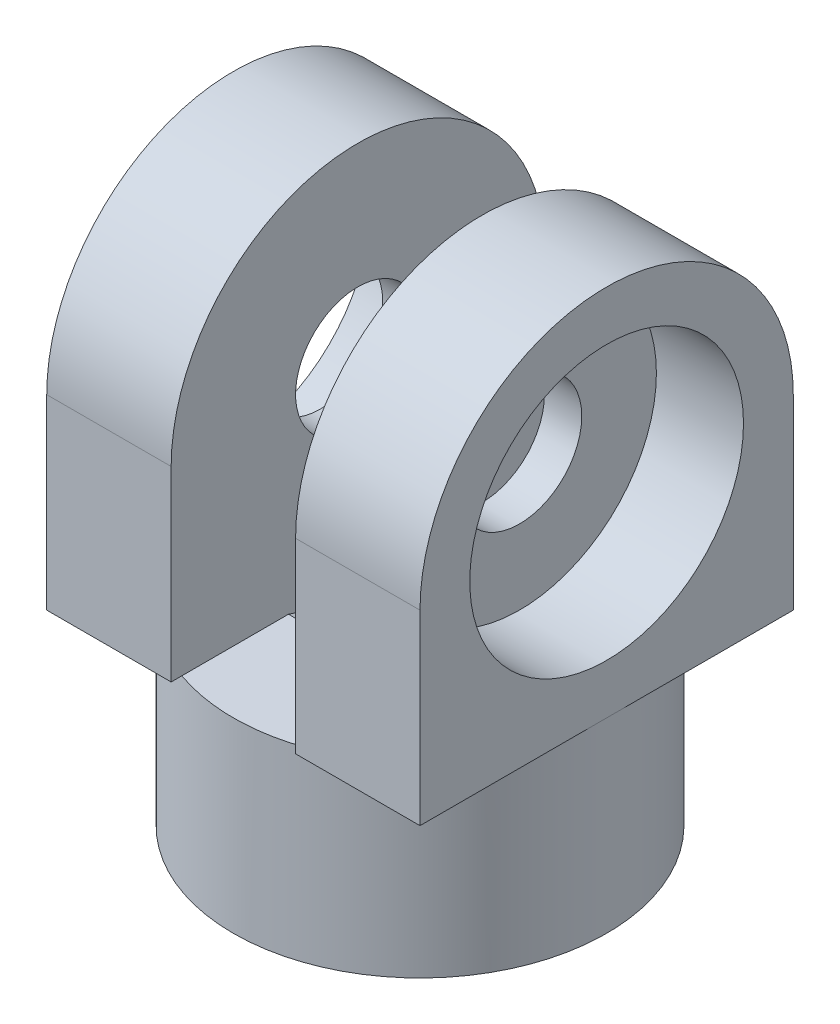
ISO-10303-21;
HEADER;
FILE_DESCRIPTION(('STEP AP214'),'2;1');
FILE_NAME('part.step','',(''),(''),'','','');
FILE_SCHEMA(('AUTOMOTIVE_DESIGN { 1 0 10303 214 1 1 1 1 }'));
ENDSEC;
DATA;
#1=APPLICATION_CONTEXT('core data for automotive mechanical design processes');
#2=APPLICATION_PROTOCOL_DEFINITION('international standard','automotive_design',2000,#1);
#3=PRODUCT_CONTEXT('',#1,'mechanical');
#4=PRODUCT('Part','Part','',(#3));
#5=PRODUCT_RELATED_PRODUCT_CATEGORY('part','',(#4));
#6=PRODUCT_DEFINITION_FORMATION('','',#4);
#7=PRODUCT_DEFINITION_CONTEXT('part definition',#1,'design');
#8=PRODUCT_DEFINITION('design','',#6,#7);
#9=PRODUCT_DEFINITION_SHAPE('','',#8);
#10=(LENGTH_UNIT() NAMED_UNIT(*) SI_UNIT(.MILLI.,.METRE.));
#11=(NAMED_UNIT(*) PLANE_ANGLE_UNIT() SI_UNIT($,.RADIAN.));
#12=(NAMED_UNIT(*) SI_UNIT($,.STERADIAN.) SOLID_ANGLE_UNIT());
#13=UNCERTAINTY_MEASURE_WITH_UNIT(LENGTH_MEASURE(1.E-05),#10,'distance_accuracy_value','');
#14=(GEOMETRIC_REPRESENTATION_CONTEXT(3) GLOBAL_UNCERTAINTY_ASSIGNED_CONTEXT((#13)) GLOBAL_UNIT_ASSIGNED_CONTEXT((#10,
#11,#12)) REPRESENTATION_CONTEXT('',''));
#15=CARTESIAN_POINT('',(0.,0.,0.));
#16=DIRECTION('',(0.,0.,1.));
#17=DIRECTION('',(1.,0.,0.));
#18=AXIS2_PLACEMENT_3D('',#15,#16,#17);
#19=CARTESIAN_POINT('',(-15.,30.,0.));
#20=DIRECTION('',(1.,0.,0.));
#21=DIRECTION('',(0.,0.,-1.));
#22=AXIS2_PLACEMENT_3D('',#19,#20,#21);
#23=CYLINDRICAL_SURFACE('',#22,5.);
#24=CARTESIAN_POINT('',(5.,30.,0.));
#25=DIRECTION('',(1.,0.,0.));
#26=DIRECTION('',(0.,0.,-1.));
#27=AXIS2_PLACEMENT_3D('',#24,#25,#26);
#28=CIRCLE('',#27,5.);
#29=CARTESIAN_POINT('',(5.,30.,-5.));
#30=VERTEX_POINT('',#29);
#31=EDGE_CURVE('E210',#30,#30,#28,.F.);
#32=ORIENTED_EDGE('',*,*,#31,.T.);
#33=EDGE_LOOP('',(#32));
#34=FACE_BOUND('',#33,.T.);
#35=CARTESIAN_POINT('',(8.,30.,0.));
#36=DIRECTION('',(1.,0.,0.));
#37=DIRECTION('',(0.,0.,-1.));
#38=AXIS2_PLACEMENT_3D('',#35,#36,#37);
#39=CIRCLE('',#38,5.);
#40=CARTESIAN_POINT('',(8.,30.,-5.));
#41=VERTEX_POINT('',#40);
#42=EDGE_CURVE('E461',#41,#41,#39,.T.);
#43=ORIENTED_EDGE('',*,*,#42,.T.);
#44=EDGE_LOOP('',(#43));
#45=FACE_BOUND('',#44,.T.);
#46=ADVANCED_FACE('F39',(#34,#45),#23,.F.);
#47=CARTESIAN_POINT('',(-5.,30.,0.));
#48=DIRECTION('',(1.,0.,0.));
#49=DIRECTION('',(0.,0.,-1.));
#50=AXIS2_PLACEMENT_3D('',#47,#48,#49);
#51=CIRCLE('',#50,5.);
#52=CARTESIAN_POINT('',(-5.,30.,-5.));
#53=VERTEX_POINT('',#52);
#54=EDGE_CURVE('E43',#53,#53,#51,.F.);
#55=ORIENTED_EDGE('',*,*,#54,.F.);
#56=EDGE_LOOP('',(#55));
#57=FACE_BOUND('',#56,.T.);
#58=CARTESIAN_POINT('',(-8.,30.,0.));
#59=DIRECTION('',(-1.,0.,0.));
#60=DIRECTION('',(0.,0.,1.));
#61=AXIS2_PLACEMENT_3D('',#58,#59,#60);
#62=CIRCLE('',#61,5.);
#63=CARTESIAN_POINT('',(-8.,30.,5.));
#64=VERTEX_POINT('',#63);
#65=EDGE_CURVE('E466',#64,#64,#62,.T.);
#66=ORIENTED_EDGE('',*,*,#65,.T.);
#67=EDGE_LOOP('',(#66));
#68=FACE_BOUND('',#67,.T.);
#69=ADVANCED_FACE('F283',(#57,#68),#23,.F.);
#70=CARTESIAN_POINT('',(15.,15.0000000000001,15.0000000000001));
#71=DIRECTION('',(0.,0.,-1.));
#72=DIRECTION('',(0.,1.,0.));
#73=AXIS2_PLACEMENT_3D('',#70,#71,#72);
#74=PLANE('',#73);
#75=DIRECTION('',(-1.,0.,0.));
#76=VECTOR('',#75,1.);
#77=CARTESIAN_POINT('',(15.,15.0000000000001,15.0000000000001));
#78=LINE('',#77,#76);
#79=CARTESIAN_POINT('',(-5.,15.0000000000001,15.0000000000002));
#80=VERTEX_POINT('',#79);
#81=CARTESIAN_POINT('',(-15.,15.0000000000001,15.0000000000001));
#82=VERTEX_POINT('',#81);
#83=EDGE_CURVE('E154',#80,#82,#78,.T.);
#84=ORIENTED_EDGE('',*,*,#83,.F.);
#85=DIRECTION('',(0.,-1.,0.));
#86=VECTOR('',#85,1.);
#87=CARTESIAN_POINT('',(-5.,15.0000000000001,15.0000000000001));
#88=LINE('',#87,#86);
#89=CARTESIAN_POINT('',(-5.,30.0000000000001,15.));
#90=VERTEX_POINT('',#89);
#91=EDGE_CURVE('E140',#90,#80,#88,.T.);
#92=ORIENTED_EDGE('',*,*,#91,.F.);
#93=DIRECTION('',(1.,0.,0.));
#94=VECTOR('',#93,1.);
#95=CARTESIAN_POINT('',(15.,30.,15.));
#96=LINE('',#95,#94);
#97=CARTESIAN_POINT('',(-15.,30.0000000000001,15.));
#98=VERTEX_POINT('',#97);
#99=EDGE_CURVE('E195',#98,#90,#96,.T.);
#100=ORIENTED_EDGE('',*,*,#99,.F.);
#101=DIRECTION('',(0.,1.,0.));
#102=VECTOR('',#101,1.);
#103=CARTESIAN_POINT('',(-15.,15.0000000000001,15.0000000000001));
#104=LINE('',#103,#102);
#105=EDGE_CURVE('E164',#82,#98,#104,.T.);
#106=ORIENTED_EDGE('',*,*,#105,.F.);
#107=EDGE_LOOP('',(#84,#92,#100,#106));
#108=FACE_BOUND('',#107,.T.);
#109=ADVANCED_FACE('F162',(#108),#74,.F.);
#110=DIRECTION('',(0.,-1.,0.));
#111=VECTOR('',#110,1.);
#112=CARTESIAN_POINT('',(5.,15.0000000000001,15.0000000000001));
#113=LINE('',#112,#111);
#114=CARTESIAN_POINT('',(5.,30.,15.));
#115=VERTEX_POINT('',#114);
#116=CARTESIAN_POINT('',(5.,15.0000000000001,15.0000000000002));
#117=VERTEX_POINT('',#116);
#118=EDGE_CURVE('E230',#115,#117,#113,.T.);
#119=ORIENTED_EDGE('',*,*,#118,.T.);
#120=CARTESIAN_POINT('',(15.,15.0000000000001,15.0000000000001));
#121=VERTEX_POINT('',#120);
#122=EDGE_CURVE('E170',#121,#117,#78,.T.);
#123=ORIENTED_EDGE('',*,*,#122,.F.);
#124=DIRECTION('',(0.,1.,0.));
#125=VECTOR('',#124,1.);
#126=CARTESIAN_POINT('',(15.,15.0000000000001,15.0000000000001));
#127=LINE('',#126,#125);
#128=CARTESIAN_POINT('',(15.,30.0000000000001,15.));
#129=VERTEX_POINT('',#128);
#130=EDGE_CURVE('E190',#121,#129,#127,.T.);
#131=ORIENTED_EDGE('',*,*,#130,.T.);
#132=EDGE_CURVE('E193',#115,#129,#96,.T.);
#133=ORIENTED_EDGE('',*,*,#132,.F.);
#134=EDGE_LOOP('',(#119,#123,#131,#133));
#135=FACE_BOUND('',#134,.T.);
#136=ADVANCED_FACE('F308',(#135),#74,.F.);
#137=CARTESIAN_POINT('',(15.,14.9999999999999,-14.9999999999999));
#138=DIRECTION('',(0.,0.,1.));
#139=DIRECTION('',(0.,-1.,0.));
#140=AXIS2_PLACEMENT_3D('',#137,#138,#139);
#141=PLANE('',#140);
#142=DIRECTION('',(0.,1.,0.));
#143=VECTOR('',#142,1.);
#144=CARTESIAN_POINT('',(-5.,14.9999999999999,-14.9999999999999));
#145=LINE('',#144,#143);
#146=CARTESIAN_POINT('',(-5.,15.0000000000001,-14.9999999999999));
#147=VERTEX_POINT('',#146);
#148=CARTESIAN_POINT('',(-5.,30.,-15.));
#149=VERTEX_POINT('',#148);
#150=EDGE_CURVE('E149',#147,#149,#145,.T.);
#151=ORIENTED_EDGE('',*,*,#150,.F.);
#152=DIRECTION('',(1.,0.,0.));
#153=VECTOR('',#152,1.);
#154=CARTESIAN_POINT('',(15.,14.9999999999999,-14.9999999999999));
#155=LINE('',#154,#153);
#156=CARTESIAN_POINT('',(-15.,14.9999999999999,-14.9999999999999));
#157=VERTEX_POINT('',#156);
#158=EDGE_CURVE('E176',#157,#147,#155,.T.);
#159=ORIENTED_EDGE('',*,*,#158,.F.);
#160=DIRECTION('',(0.,1.,0.));
#161=VECTOR('',#160,1.);
#162=CARTESIAN_POINT('',(-15.,14.9999999999999,-14.9999999999999));
#163=LINE('',#162,#161);
#164=CARTESIAN_POINT('',(-15.,29.9999999999999,-15.));
#165=VERTEX_POINT('',#164);
#166=EDGE_CURVE('E184',#157,#165,#163,.T.);
#167=ORIENTED_EDGE('',*,*,#166,.T.);
#168=DIRECTION('',(1.,0.,0.));
#169=VECTOR('',#168,1.);
#170=CARTESIAN_POINT('',(15.,29.9999999999999,-15.));
#171=LINE('',#170,#169);
#172=EDGE_CURVE('E194',#165,#149,#171,.T.);
#173=ORIENTED_EDGE('',*,*,#172,.T.);
#174=EDGE_LOOP('',(#151,#159,#167,#173));
#175=FACE_BOUND('',#174,.T.);
#176=ADVANCED_FACE('F240',(#175),#141,.F.);
#177=CARTESIAN_POINT('',(0.,15.,-1.03422376951923E-13));
#178=DIRECTION('',(0.,1.,0.));
#179=DIRECTION('',(0.,0.,1.));
#180=AXIS2_PLACEMENT_3D('',#177,#178,#179);
#181=PLANE('',#180);
#182=DIRECTION('',(0.,0.,1.));
#183=VECTOR('',#182,1.);
#184=CARTESIAN_POINT('',(5.,15.0000000000001,-51.9999999999998));
#185=LINE('',#184,#183);
#186=CARTESIAN_POINT('',(5.,15.0000000000001,14.142135623731));
#187=VERTEX_POINT('',#186);
#188=EDGE_CURVE('E254',#187,#117,#185,.T.);
#189=ORIENTED_EDGE('',*,*,#188,.F.);
#190=CARTESIAN_POINT('',(0.,15.,0.));
#191=DIRECTION('',(0.,1.,0.));
#192=DIRECTION('',(0.,0.,1.));
#193=AXIS2_PLACEMENT_3D('',#190,#191,#192);
#194=CIRCLE('',#193,15.);
#195=CARTESIAN_POINT('',(15.,15.,0.));
#196=VERTEX_POINT('',#195);
#197=EDGE_CURVE('E48',#187,#196,#194,.T.);
#198=ORIENTED_EDGE('',*,*,#197,.T.);
#199=DIRECTION('',(0.,0.,1.));
#200=VECTOR('',#199,1.);
#201=CARTESIAN_POINT('',(15.,15.0000000000001,15.0000000000001));
#202=LINE('',#201,#200);
#203=EDGE_CURVE('E146',#196,#121,#202,.T.);
#204=ORIENTED_EDGE('',*,*,#203,.T.);
#205=ORIENTED_EDGE('',*,*,#122,.T.);
#206=EDGE_LOOP('',(#189,#198,#204,#205));
#207=FACE_BOUND('',#206,.T.);
#208=ADVANCED_FACE('F257',(#207),#181,.F.);
#209=CARTESIAN_POINT('',(5.,15.0000000000001,-14.9999999999999));
#210=VERTEX_POINT('',#209);
#211=CARTESIAN_POINT('',(5.,15.0000000000001,-14.1421356237309));
#212=VERTEX_POINT('',#211);
#213=EDGE_CURVE('E265',#210,#212,#185,.T.);
#214=ORIENTED_EDGE('',*,*,#213,.F.);
#215=CARTESIAN_POINT('',(15.,14.9999999999999,-14.9999999999999));
#216=VERTEX_POINT('',#215);
#217=EDGE_CURVE('E180',#210,#216,#155,.T.);
#218=ORIENTED_EDGE('',*,*,#217,.T.);
#219=EDGE_CURVE('E169',#216,#196,#202,.T.);
#220=ORIENTED_EDGE('',*,*,#219,.T.);
#221=EDGE_CURVE('E49',#196,#212,#194,.T.);
#222=ORIENTED_EDGE('',*,*,#221,.T.);
#223=EDGE_LOOP('',(#214,#218,#220,#222));
#224=FACE_BOUND('',#223,.T.);
#225=ADVANCED_FACE('F305',(#224),#181,.F.);
#226=ORIENTED_EDGE('',*,*,#217,.F.);
#227=DIRECTION('',(0.,1.,0.));
#228=VECTOR('',#227,1.);
#229=CARTESIAN_POINT('',(5.,14.9999999999999,-14.9999999999999));
#230=LINE('',#229,#228);
#231=CARTESIAN_POINT('',(5.,30.,-15.));
#232=VERTEX_POINT('',#231);
#233=EDGE_CURVE('E212',#210,#232,#230,.T.);
#234=ORIENTED_EDGE('',*,*,#233,.T.);
#235=CARTESIAN_POINT('',(15.,29.9999999999999,-15.));
#236=VERTEX_POINT('',#235);
#237=EDGE_CURVE('E192',#232,#236,#171,.T.);
#238=ORIENTED_EDGE('',*,*,#237,.T.);
#239=DIRECTION('',(0.,1.,0.));
#240=VECTOR('',#239,1.);
#241=CARTESIAN_POINT('',(15.,14.9999999999999,-14.9999999999999));
#242=LINE('',#241,#240);
#243=EDGE_CURVE('E182',#216,#236,#242,.T.);
#244=ORIENTED_EDGE('',*,*,#243,.F.);
#245=EDGE_LOOP('',(#226,#234,#238,#244));
#246=FACE_BOUND('',#245,.T.);
#247=ADVANCED_FACE('F296',(#246),#141,.F.);
#248=CARTESIAN_POINT('',(15.,30.,0.));
#249=DIRECTION('',(1.,0.,0.));
#250=DIRECTION('',(0.,0.,-1.));
#251=AXIS2_PLACEMENT_3D('',#248,#249,#250);
#252=CYLINDRICAL_SURFACE('',#251,15.);
#253=CARTESIAN_POINT('',(-5.,30.,0.));
#254=DIRECTION('',(1.,0.,0.));
#255=DIRECTION('',(0.,0.,-1.));
#256=AXIS2_PLACEMENT_3D('',#253,#254,#255);
#257=CIRCLE('',#256,15.);
#258=EDGE_CURVE('E145',#149,#90,#257,.T.);
#259=ORIENTED_EDGE('',*,*,#258,.F.);
#260=ORIENTED_EDGE('',*,*,#172,.F.);
#261=CARTESIAN_POINT('',(-15.,30.,0.));
#262=DIRECTION('',(1.,0.,0.));
#263=DIRECTION('',(0.,0.,-1.));
#264=AXIS2_PLACEMENT_3D('',#261,#262,#263);
#265=CIRCLE('',#264,15.);
#266=EDGE_CURVE('E196',#165,#98,#265,.T.);
#267=ORIENTED_EDGE('',*,*,#266,.T.);
#268=ORIENTED_EDGE('',*,*,#99,.T.);
#269=EDGE_LOOP('',(#259,#260,#267,#268));
#270=FACE_BOUND('',#269,.T.);
#271=ADVANCED_FACE('F237',(#270),#252,.T.);
#272=CARTESIAN_POINT('',(0.,30.,0.));
#273=DIRECTION('',(0.,-1.,0.));
#274=DIRECTION('',(0.,0.,-1.));
#275=AXIS2_PLACEMENT_3D('',#272,#273,#274);
#276=CYLINDRICAL_SURFACE('',#275,15.);
#277=CARTESIAN_POINT('',(0.,0.,0.));
#278=DIRECTION('',(0.,1.,0.));
#279=DIRECTION('',(0.,0.,1.));
#280=AXIS2_PLACEMENT_3D('',#277,#278,#279);
#281=CIRCLE('',#280,15.);
#282=CARTESIAN_POINT('',(0.,0.,15.));
#283=VERTEX_POINT('',#282);
#284=EDGE_CURVE('E204',#283,#283,#281,.T.);
#285=ORIENTED_EDGE('',*,*,#284,.T.);
#286=EDGE_LOOP('',(#285));
#287=FACE_BOUND('',#286,.T.);
#288=CARTESIAN_POINT('',(-5.,15.0000000000001,14.142135623731));
#289=VERTEX_POINT('',#288);
#290=EDGE_CURVE('E11',#289,#187,#194,.T.);
#291=ORIENTED_EDGE('',*,*,#290,.F.);
#292=CARTESIAN_POINT('',(-15.,15.,0.));
#293=VERTEX_POINT('',#292);
#294=EDGE_CURVE('E158',#293,#289,#194,.T.);
#295=ORIENTED_EDGE('',*,*,#294,.F.);
#296=CARTESIAN_POINT('',(-5.,15.0000000000001,-14.1421356237309));
#297=VERTEX_POINT('',#296);
#298=EDGE_CURVE('E51',#297,#293,#194,.T.);
#299=ORIENTED_EDGE('',*,*,#298,.F.);
#300=EDGE_CURVE('E206',#212,#297,#194,.T.);
#301=ORIENTED_EDGE('',*,*,#300,.F.);
#302=ORIENTED_EDGE('',*,*,#221,.F.);
#303=ORIENTED_EDGE('',*,*,#197,.F.);
#304=EDGE_LOOP('',(#291,#295,#299,#301,#302,#303));
#305=FACE_BOUND('',#304,.T.);
#306=ADVANCED_FACE('F41',(#287,#305),#276,.T.);
#307=CARTESIAN_POINT('',(0.,0.,0.));
#308=DIRECTION('',(0.,1.,0.));
#309=DIRECTION('',(0.,0.,1.));
#310=AXIS2_PLACEMENT_3D('',#307,#308,#309);
#311=PLANE('',#310);
#312=ORIENTED_EDGE('',*,*,#284,.F.);
#313=EDGE_LOOP('',(#312));
#314=FACE_BOUND('',#313,.T.);
#315=ADVANCED_FACE('F312',(#314),#311,.F.);
#316=ORIENTED_EDGE('',*,*,#158,.T.);
#317=DIRECTION('',(0.,0.,1.));
#318=VECTOR('',#317,1.);
#319=CARTESIAN_POINT('',(-5.,15.0000000000001,-51.9999999999998));
#320=LINE('',#319,#318);
#321=EDGE_CURVE('E165',#147,#297,#320,.T.);
#322=ORIENTED_EDGE('',*,*,#321,.T.);
#323=ORIENTED_EDGE('',*,*,#298,.T.);
#324=DIRECTION('',(0.,0.,-1.));
#325=VECTOR('',#324,1.);
#326=CARTESIAN_POINT('',(-15.,15.0000000000001,15.0000000000001));
#327=LINE('',#326,#325);
#328=EDGE_CURVE('E172',#293,#157,#327,.T.);
#329=ORIENTED_EDGE('',*,*,#328,.T.);
#330=EDGE_LOOP('',(#316,#322,#323,#329));
#331=FACE_BOUND('',#330,.T.);
#332=ADVANCED_FACE('F241',(#331),#181,.F.);
#333=ORIENTED_EDGE('',*,*,#294,.T.);
#334=EDGE_CURVE('E143',#289,#80,#320,.T.);
#335=ORIENTED_EDGE('',*,*,#334,.T.);
#336=ORIENTED_EDGE('',*,*,#83,.T.);
#337=EDGE_CURVE('E173',#82,#293,#327,.T.);
#338=ORIENTED_EDGE('',*,*,#337,.T.);
#339=EDGE_LOOP('',(#333,#335,#336,#338));
#340=FACE_BOUND('',#339,.T.);
#341=ADVANCED_FACE('F153',(#340),#181,.F.);
#342=ORIENTED_EDGE('',*,*,#237,.F.);
#343=CARTESIAN_POINT('',(5.,30.,0.));
#344=DIRECTION('',(1.,0.,0.));
#345=DIRECTION('',(0.,0.,-1.));
#346=AXIS2_PLACEMENT_3D('',#343,#344,#345);
#347=CIRCLE('',#346,15.);
#348=EDGE_CURVE('E207',#232,#115,#347,.T.);
#349=ORIENTED_EDGE('',*,*,#348,.T.);
#350=ORIENTED_EDGE('',*,*,#132,.T.);
#351=CARTESIAN_POINT('',(15.,30.,0.));
#352=DIRECTION('',(1.,0.,0.));
#353=DIRECTION('',(0.,0.,-1.));
#354=AXIS2_PLACEMENT_3D('',#351,#352,#353);
#355=CIRCLE('',#354,15.);
#356=EDGE_CURVE('E203',#236,#129,#355,.T.);
#357=ORIENTED_EDGE('',*,*,#356,.F.);
#358=EDGE_LOOP('',(#342,#349,#350,#357));
#359=FACE_BOUND('',#358,.T.);
#360=ADVANCED_FACE('F300',(#359),#252,.T.);
#361=CARTESIAN_POINT('',(-15.,30.,0.));
#362=DIRECTION('',(1.,0.,0.));
#363=DIRECTION('',(0.,0.,-1.));
#364=AXIS2_PLACEMENT_3D('',#361,#362,#363);
#365=PLANE('',#364);
#366=CARTESIAN_POINT('',(-15.,30.,0.));
#367=DIRECTION('',(-1.,0.,0.));
#368=DIRECTION('',(0.,0.,1.));
#369=AXIS2_PLACEMENT_3D('',#366,#367,#368);
#370=CIRCLE('',#369,11.);
#371=CARTESIAN_POINT('',(-15.,30.,11.));
#372=VERTEX_POINT('',#371);
#373=EDGE_CURVE('E472',#372,#372,#370,.T.);
#374=ORIENTED_EDGE('',*,*,#373,.F.);
#375=EDGE_LOOP('',(#374));
#376=FACE_BOUND('',#375,.T.);
#377=ORIENTED_EDGE('',*,*,#266,.F.);
#378=ORIENTED_EDGE('',*,*,#166,.F.);
#379=ORIENTED_EDGE('',*,*,#328,.F.);
#380=ORIENTED_EDGE('',*,*,#337,.F.);
#381=ORIENTED_EDGE('',*,*,#105,.T.);
#382=EDGE_LOOP('',(#377,#378,#379,#380,#381));
#383=FACE_BOUND('',#382,.T.);
#384=ADVANCED_FACE('F244',(#376,#383),#365,.F.);
#385=CARTESIAN_POINT('',(15.,30.,0.));
#386=DIRECTION('',(-1.,0.,0.));
#387=DIRECTION('',(0.,0.,1.));
#388=AXIS2_PLACEMENT_3D('',#385,#386,#387);
#389=PLANE('',#388);
#390=CARTESIAN_POINT('',(15.,30.,0.));
#391=DIRECTION('',(1.,0.,0.));
#392=DIRECTION('',(0.,0.,-1.));
#393=AXIS2_PLACEMENT_3D('',#390,#391,#392);
#394=CIRCLE('',#393,11.);
#395=CARTESIAN_POINT('',(15.,30.,-11.));
#396=VERTEX_POINT('',#395);
#397=EDGE_CURVE('E467',#396,#396,#394,.T.);
#398=ORIENTED_EDGE('',*,*,#397,.F.);
#399=EDGE_LOOP('',(#398));
#400=FACE_BOUND('',#399,.T.);
#401=ORIENTED_EDGE('',*,*,#356,.T.);
#402=ORIENTED_EDGE('',*,*,#130,.F.);
#403=ORIENTED_EDGE('',*,*,#203,.F.);
#404=ORIENTED_EDGE('',*,*,#219,.F.);
#405=ORIENTED_EDGE('',*,*,#243,.T.);
#406=EDGE_LOOP('',(#401,#402,#403,#404,#405));
#407=FACE_BOUND('',#406,.T.);
#408=ADVANCED_FACE('F307',(#400,#407),#389,.F.);
#409=CARTESIAN_POINT('',(-5.,29.9999999999999,0.));
#410=DIRECTION('',(1.,0.,0.));
#411=DIRECTION('',(0.,0.,-1.));
#412=AXIS2_PLACEMENT_3D('',#409,#410,#411);
#413=CYLINDRICAL_SURFACE('',#412,16.);
#414=CARTESIAN_POINT('',(5.,29.9999999999999,0.));
#415=DIRECTION('',(1.,0.,0.));
#416=DIRECTION('',(0.,0.,-1.));
#417=AXIS2_PLACEMENT_3D('',#414,#415,#416);
#418=CIRCLE('',#417,16.);
#419=CARTESIAN_POINT('',(5.,15.0000000000001,5.56776436283049));
#420=VERTEX_POINT('',#419);
#421=CARTESIAN_POINT('',(5.,15.0000000000001,-5.56776436283049));
#422=VERTEX_POINT('',#421);
#423=EDGE_CURVE('E220',#420,#422,#418,.T.);
#424=ORIENTED_EDGE('',*,*,#423,.T.);
#425=DIRECTION('',(1.,0.,0.));
#426=VECTOR('',#425,1.);
#427=CARTESIAN_POINT('',(-5.,15.0000000000001,-5.56776436283049));
#428=LINE('',#427,#426);
#429=CARTESIAN_POINT('',(-5.,15.0000000000001,-5.56776436283049));
#430=VERTEX_POINT('',#429);
#431=EDGE_CURVE('E222',#422,#430,#428,.F.);
#432=ORIENTED_EDGE('',*,*,#431,.T.);
#433=CARTESIAN_POINT('',(-5.,29.9999999999999,0.));
#434=DIRECTION('',(1.,0.,0.));
#435=DIRECTION('',(0.,0.,-1.));
#436=AXIS2_PLACEMENT_3D('',#433,#434,#435);
#437=CIRCLE('',#436,16.);
#438=CARTESIAN_POINT('',(-5.,15.0000000000001,5.56776436283049));
#439=VERTEX_POINT('',#438);
#440=EDGE_CURVE('E209',#439,#430,#437,.T.);
#441=ORIENTED_EDGE('',*,*,#440,.F.);
#442=DIRECTION('',(1.,0.,0.));
#443=VECTOR('',#442,1.);
#444=CARTESIAN_POINT('',(-5.,15.0000000000001,5.56776436283049));
#445=LINE('',#444,#443);
#446=EDGE_CURVE('E264',#439,#420,#445,.T.);
#447=ORIENTED_EDGE('',*,*,#446,.T.);
#448=EDGE_LOOP('',(#424,#432,#441,#447));
#449=FACE_BOUND('',#448,.T.);
#450=ADVANCED_FACE('F269',(#449),#413,.F.);
#451=CARTESIAN_POINT('',(-5.,29.9999999999999,0.));
#452=DIRECTION('',(1.,0.,0.));
#453=DIRECTION('',(0.,0.,-1.));
#454=AXIS2_PLACEMENT_3D('',#451,#452,#453);
#455=PLANE('',#454);
#456=ORIENTED_EDGE('',*,*,#54,.T.);
#457=EDGE_LOOP('',(#456));
#458=FACE_BOUND('',#457,.T.);
#459=ORIENTED_EDGE('',*,*,#150,.T.);
#460=ORIENTED_EDGE('',*,*,#258,.T.);
#461=ORIENTED_EDGE('',*,*,#91,.T.);
#462=ORIENTED_EDGE('',*,*,#334,.F.);
#463=EDGE_CURVE('E157',#439,#289,#320,.T.);
#464=ORIENTED_EDGE('',*,*,#463,.F.);
#465=ORIENTED_EDGE('',*,*,#440,.T.);
#466=EDGE_CURVE('E59',#297,#430,#320,.T.);
#467=ORIENTED_EDGE('',*,*,#466,.F.);
#468=ORIENTED_EDGE('',*,*,#321,.F.);
#469=EDGE_LOOP('',(#459,#460,#461,#462,#464,#465,#467,#468));
#470=FACE_BOUND('',#469,.T.);
#471=ADVANCED_FACE('F137',(#458,#470),#455,.T.);
#472=CARTESIAN_POINT('',(5.,29.9999999999999,0.));
#473=DIRECTION('',(1.,0.,0.));
#474=DIRECTION('',(0.,0.,-1.));
#475=AXIS2_PLACEMENT_3D('',#472,#473,#474);
#476=PLANE('',#475);
#477=ORIENTED_EDGE('',*,*,#31,.F.);
#478=EDGE_LOOP('',(#477));
#479=FACE_BOUND('',#478,.T.);
#480=ORIENTED_EDGE('',*,*,#348,.F.);
#481=ORIENTED_EDGE('',*,*,#233,.F.);
#482=ORIENTED_EDGE('',*,*,#213,.T.);
#483=EDGE_CURVE('E260',#212,#422,#185,.T.);
#484=ORIENTED_EDGE('',*,*,#483,.T.);
#485=ORIENTED_EDGE('',*,*,#423,.F.);
#486=EDGE_CURVE('E63',#420,#187,#185,.T.);
#487=ORIENTED_EDGE('',*,*,#486,.T.);
#488=ORIENTED_EDGE('',*,*,#188,.T.);
#489=ORIENTED_EDGE('',*,*,#118,.F.);
#490=EDGE_LOOP('',(#480,#481,#482,#484,#485,#487,#488,#489));
#491=FACE_BOUND('',#490,.T.);
#492=ADVANCED_FACE('F255',(#479,#491),#476,.F.);
#493=CARTESIAN_POINT('',(-5.,15.0000000000001,-51.9999999999998));
#494=DIRECTION('',(0.,-1.,0.));
#495=DIRECTION('',(0.,0.,-1.));
#496=AXIS2_PLACEMENT_3D('',#493,#494,#495);
#497=PLANE('',#496);
#498=ORIENTED_EDGE('',*,*,#290,.T.);
#499=ORIENTED_EDGE('',*,*,#486,.F.);
#500=ORIENTED_EDGE('',*,*,#446,.F.);
#501=ORIENTED_EDGE('',*,*,#463,.T.);
#502=EDGE_LOOP('',(#498,#499,#500,#501));
#503=FACE_BOUND('',#502,.T.);
#504=ADVANCED_FACE('F247',(#503),#497,.F.);
#505=ORIENTED_EDGE('',*,*,#483,.F.);
#506=ORIENTED_EDGE('',*,*,#300,.T.);
#507=ORIENTED_EDGE('',*,*,#466,.T.);
#508=ORIENTED_EDGE('',*,*,#431,.F.);
#509=EDGE_LOOP('',(#505,#506,#507,#508));
#510=FACE_BOUND('',#509,.T.);
#511=ADVANCED_FACE('F271',(#510),#497,.F.);
#512=CARTESIAN_POINT('',(-8.,30.,0.));
#513=DIRECTION('',(-1.,0.,0.));
#514=DIRECTION('',(0.,0.,1.));
#515=AXIS2_PLACEMENT_3D('',#512,#513,#514);
#516=CYLINDRICAL_SURFACE('',#515,11.);
#517=CARTESIAN_POINT('',(-8.,30.,0.));
#518=DIRECTION('',(-1.,0.,0.));
#519=DIRECTION('',(0.,0.,1.));
#520=AXIS2_PLACEMENT_3D('',#517,#518,#519);
#521=CIRCLE('',#520,11.);
#522=CARTESIAN_POINT('',(-8.,30.,11.));
#523=VERTEX_POINT('',#522);
#524=EDGE_CURVE('E159',#523,#523,#521,.T.);
#525=ORIENTED_EDGE('',*,*,#524,.F.);
#526=EDGE_LOOP('',(#525));
#527=FACE_BOUND('',#526,.T.);
#528=ORIENTED_EDGE('',*,*,#373,.T.);
#529=EDGE_LOOP('',(#528));
#530=FACE_BOUND('',#529,.T.);
#531=ADVANCED_FACE('F272',(#527,#530),#516,.F.);
#532=CARTESIAN_POINT('',(-8.,30.,0.));
#533=DIRECTION('',(-1.,0.,0.));
#534=DIRECTION('',(0.,0.,1.));
#535=AXIS2_PLACEMENT_3D('',#532,#533,#534);
#536=PLANE('',#535);
#537=ORIENTED_EDGE('',*,*,#65,.F.);
#538=EDGE_LOOP('',(#537));
#539=FACE_BOUND('',#538,.T.);
#540=ORIENTED_EDGE('',*,*,#524,.T.);
#541=EDGE_LOOP('',(#540));
#542=FACE_BOUND('',#541,.T.);
#543=ADVANCED_FACE('F278',(#539,#542),#536,.T.);
#544=CARTESIAN_POINT('',(8.,30.,0.));
#545=DIRECTION('',(1.,0.,0.));
#546=DIRECTION('',(0.,0.,-1.));
#547=AXIS2_PLACEMENT_3D('',#544,#545,#546);
#548=CYLINDRICAL_SURFACE('',#547,11.);
#549=CARTESIAN_POINT('',(8.,30.,0.));
#550=DIRECTION('',(1.,0.,0.));
#551=DIRECTION('',(0.,0.,-1.));
#552=AXIS2_PLACEMENT_3D('',#549,#550,#551);
#553=CIRCLE('',#552,11.);
#554=CARTESIAN_POINT('',(8.,30.,-11.));
#555=VERTEX_POINT('',#554);
#556=EDGE_CURVE('E470',#555,#555,#553,.T.);
#557=ORIENTED_EDGE('',*,*,#556,.F.);
#558=EDGE_LOOP('',(#557));
#559=FACE_BOUND('',#558,.T.);
#560=ORIENTED_EDGE('',*,*,#397,.T.);
#561=EDGE_LOOP('',(#560));
#562=FACE_BOUND('',#561,.T.);
#563=ADVANCED_FACE('F432',(#559,#562),#548,.F.);
#564=CARTESIAN_POINT('',(8.,30.,0.));
#565=DIRECTION('',(1.,0.,0.));
#566=DIRECTION('',(0.,0.,-1.));
#567=AXIS2_PLACEMENT_3D('',#564,#565,#566);
#568=PLANE('',#567);
#569=ORIENTED_EDGE('',*,*,#42,.F.);
#570=EDGE_LOOP('',(#569));
#571=FACE_BOUND('',#570,.T.);
#572=ORIENTED_EDGE('',*,*,#556,.T.);
#573=EDGE_LOOP('',(#572));
#574=FACE_BOUND('',#573,.T.);
#575=ADVANCED_FACE('F450',(#571,#574),#568,.T.);
#576=CLOSED_SHELL('',(#46,#69,#109,#136,#176,#208,#225,#247,#271,#306,#315,#332,#341,#360,#384,
#408,#450,#471,#492,#504,#511,#531,#543,#563,#575));
#577=MANIFOLD_SOLID_BREP('B2',#576);
#578=ADVANCED_BREP_SHAPE_REPRESENTATION('',(#18,#577),#14);
#579=SHAPE_DEFINITION_REPRESENTATION(#9,#578);
ENDSEC;
END-ISO-10303-21;
